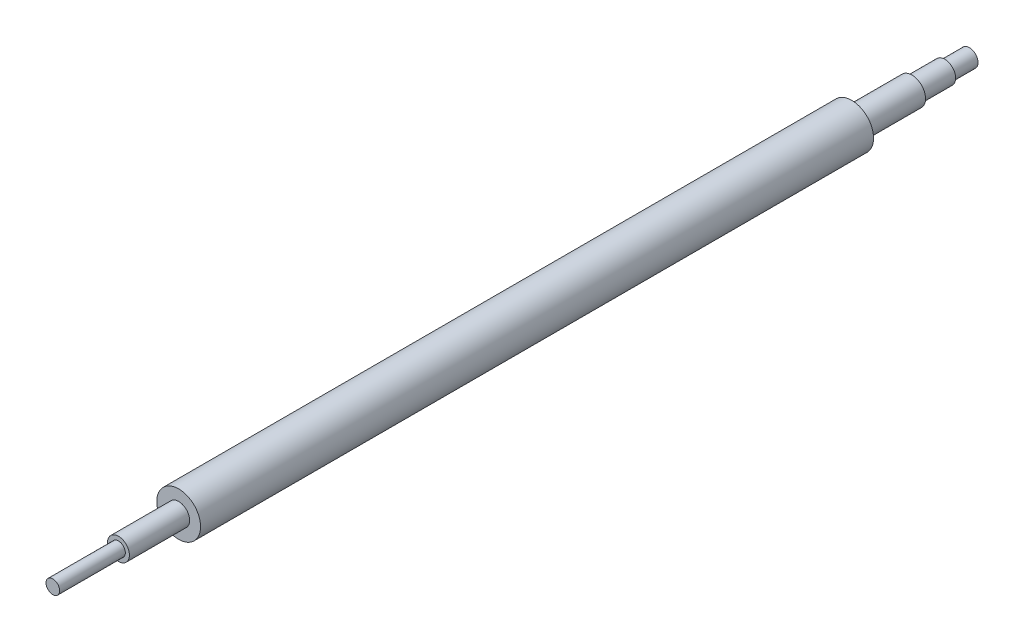
ISO-10303-21;
HEADER;
FILE_DESCRIPTION(('STEP AP214'),'2;1');
FILE_NAME('part.step','',(''),(''),'','','');
FILE_SCHEMA(('AUTOMOTIVE_DESIGN { 1 0 10303 214 1 1 1 1 }'));
ENDSEC;
DATA;
#1=APPLICATION_CONTEXT('core data for automotive mechanical design processes');
#2=APPLICATION_PROTOCOL_DEFINITION('international standard','automotive_design',2000,#1);
#3=PRODUCT_CONTEXT('',#1,'mechanical');
#4=PRODUCT('Part','Part','',(#3));
#5=PRODUCT_RELATED_PRODUCT_CATEGORY('part','',(#4));
#6=PRODUCT_DEFINITION_FORMATION('','',#4);
#7=PRODUCT_DEFINITION_CONTEXT('part definition',#1,'design');
#8=PRODUCT_DEFINITION('design','',#6,#7);
#9=PRODUCT_DEFINITION_SHAPE('','',#8);
#10=(LENGTH_UNIT() NAMED_UNIT(*) SI_UNIT(.MILLI.,.METRE.));
#11=(NAMED_UNIT(*) PLANE_ANGLE_UNIT() SI_UNIT($,.RADIAN.));
#12=(NAMED_UNIT(*) SI_UNIT($,.STERADIAN.) SOLID_ANGLE_UNIT());
#13=UNCERTAINTY_MEASURE_WITH_UNIT(LENGTH_MEASURE(1.E-05),#10,'distance_accuracy_value','');
#14=(GEOMETRIC_REPRESENTATION_CONTEXT(3) GLOBAL_UNCERTAINTY_ASSIGNED_CONTEXT((#13)) GLOBAL_UNIT_ASSIGNED_CONTEXT((#10,
#11,#12)) REPRESENTATION_CONTEXT('',''));
#15=CARTESIAN_POINT('',(0.,0.,0.));
#16=DIRECTION('',(0.,0.,1.));
#17=DIRECTION('',(1.,0.,0.));
#18=AXIS2_PLACEMENT_3D('',#15,#16,#17);
#19=CARTESIAN_POINT('',(0.,0.,292.));
#20=DIRECTION('',(0.,0.,-1.));
#21=DIRECTION('',(-1.,0.,0.));
#22=AXIS2_PLACEMENT_3D('',#19,#20,#21);
#23=CYLINDRICAL_SURFACE('',#22,2.5);
#24=CARTESIAN_POINT('',(0.,0.,292.));
#25=DIRECTION('',(0.,0.,1.));
#26=DIRECTION('',(1.,0.,0.));
#27=AXIS2_PLACEMENT_3D('',#24,#25,#26);
#28=CIRCLE('',#27,2.5);
#29=CARTESIAN_POINT('',(2.5,0.,292.));
#30=VERTEX_POINT('',#29);
#31=EDGE_CURVE('E11',#30,#30,#28,.T.);
#32=ORIENTED_EDGE('',*,*,#31,.F.);
#33=EDGE_LOOP('',(#32));
#34=FACE_BOUND('',#33,.T.);
#35=CARTESIAN_POINT('',(0.,0.,268.));
#36=DIRECTION('',(0.,0.,1.));
#37=DIRECTION('',(1.,0.,0.));
#38=AXIS2_PLACEMENT_3D('',#35,#36,#37);
#39=CIRCLE('',#38,2.5);
#40=CARTESIAN_POINT('',(2.5,0.,268.));
#41=VERTEX_POINT('',#40);
#42=EDGE_CURVE('E44',#41,#41,#39,.T.);
#43=ORIENTED_EDGE('',*,*,#42,.T.);
#44=EDGE_LOOP('',(#43));
#45=FACE_BOUND('',#44,.T.);
#46=ADVANCED_FACE('F41',(#34,#45),#23,.T.);
#47=CARTESIAN_POINT('',(0.,0.,292.));
#48=DIRECTION('',(0.,0.,1.));
#49=DIRECTION('',(1.,0.,0.));
#50=AXIS2_PLACEMENT_3D('',#47,#48,#49);
#51=PLANE('',#50);
#52=ORIENTED_EDGE('',*,*,#31,.T.);
#53=EDGE_LOOP('',(#52));
#54=FACE_BOUND('',#53,.T.);
#55=ADVANCED_FACE('F56',(#54),#51,.T.);
#56=CARTESIAN_POINT('',(0.,0.,268.));
#57=DIRECTION('',(0.,0.,1.));
#58=DIRECTION('',(1.,0.,0.));
#59=AXIS2_PLACEMENT_3D('',#56,#57,#58);
#60=PLANE('',#59);
#61=ORIENTED_EDGE('',*,*,#42,.F.);
#62=EDGE_LOOP('',(#61));
#63=FACE_BOUND('',#62,.T.);
#64=ADVANCED_FACE('F54',(#63),#60,.F.);
#65=CLOSED_SHELL('',(#46,#55,#64));
#66=MANIFOLD_SOLID_BREP('B2',#65);
#67=CARTESIAN_POINT('',(0.,0.,-34.));
#68=DIRECTION('',(0.,0.,-1.));
#69=DIRECTION('',(-1.,0.,0.));
#70=AXIS2_PLACEMENT_3D('',#67,#68,#69);
#71=PLANE('',#70);
#72=CARTESIAN_POINT('',(0.,0.,-34.));
#73=DIRECTION('',(0.,0.,-1.));
#74=DIRECTION('',(-1.,0.,0.));
#75=AXIS2_PLACEMENT_3D('',#72,#73,#74);
#76=CIRCLE('',#75,4.);
#77=CARTESIAN_POINT('',(-4.,0.,-34.));
#78=VERTEX_POINT('',#77);
#79=EDGE_CURVE('E100',#78,#78,#76,.T.);
#80=ORIENTED_EDGE('',*,*,#79,.T.);
#81=EDGE_LOOP('',(#80));
#82=FACE_BOUND('',#81,.T.);
#83=CARTESIAN_POINT('',(0.,0.,-34.));
#84=DIRECTION('',(0.,0.,-1.));
#85=DIRECTION('',(-1.,0.,0.));
#86=AXIS2_PLACEMENT_3D('',#83,#84,#85);
#87=CIRCLE('',#86,3.175);
#88=CARTESIAN_POINT('',(-3.175,0.,-34.));
#89=VERTEX_POINT('',#88);
#90=EDGE_CURVE('E108',#89,#89,#87,.T.);
#91=ORIENTED_EDGE('',*,*,#90,.F.);
#92=EDGE_LOOP('',(#91));
#93=FACE_BOUND('',#92,.T.);
#94=ADVANCED_FACE('F89',(#82,#93),#71,.T.);
#95=CARTESIAN_POINT('',(0.,0.,-22.));
#96=DIRECTION('',(0.,0.,-1.));
#97=DIRECTION('',(-1.,0.,0.));
#98=AXIS2_PLACEMENT_3D('',#95,#96,#97);
#99=PLANE('',#98);
#100=CARTESIAN_POINT('',(0.,0.,-22.));
#101=DIRECTION('',(0.,0.,-1.));
#102=DIRECTION('',(-1.,0.,0.));
#103=AXIS2_PLACEMENT_3D('',#100,#101,#102);
#104=CIRCLE('',#103,5.);
#105=CARTESIAN_POINT('',(-5.,0.,-22.));
#106=VERTEX_POINT('',#105);
#107=EDGE_CURVE('E40',#106,#106,#104,.T.);
#108=ORIENTED_EDGE('',*,*,#107,.T.);
#109=EDGE_LOOP('',(#108));
#110=FACE_BOUND('',#109,.T.);
#111=CARTESIAN_POINT('',(0.,0.,-22.));
#112=DIRECTION('',(0.,0.,-1.));
#113=DIRECTION('',(-1.,0.,0.));
#114=AXIS2_PLACEMENT_3D('',#111,#112,#113);
#115=CIRCLE('',#114,4.);
#116=CARTESIAN_POINT('',(-4.,0.,-22.));
#117=VERTEX_POINT('',#116);
#118=EDGE_CURVE('E102',#117,#117,#115,.T.);
#119=ORIENTED_EDGE('',*,*,#118,.F.);
#120=EDGE_LOOP('',(#119));
#121=FACE_BOUND('',#120,.T.);
#122=ADVANCED_FACE('F124',(#110,#121),#99,.T.);
#123=CARTESIAN_POINT('',(0.,0.,-22.));
#124=DIRECTION('',(0.,0.,1.));
#125=DIRECTION('',(1.,0.,0.));
#126=AXIS2_PLACEMENT_3D('',#123,#124,#125);
#127=CYLINDRICAL_SURFACE('',#126,5.);
#128=ORIENTED_EDGE('',*,*,#107,.F.);
#129=EDGE_LOOP('',(#128));
#130=FACE_BOUND('',#129,.T.);
#131=CARTESIAN_POINT('',(0.,0.,0.));
#132=DIRECTION('',(0.,0.,-1.));
#133=DIRECTION('',(-1.,0.,0.));
#134=AXIS2_PLACEMENT_3D('',#131,#132,#133);
#135=CIRCLE('',#134,5.);
#136=CARTESIAN_POINT('',(-5.,0.,0.));
#137=VERTEX_POINT('',#136);
#138=EDGE_CURVE('E93',#137,#137,#135,.T.);
#139=ORIENTED_EDGE('',*,*,#138,.T.);
#140=EDGE_LOOP('',(#139));
#141=FACE_BOUND('',#140,.T.);
#142=ADVANCED_FACE('F91',(#130,#141),#127,.T.);
#143=CARTESIAN_POINT('',(0.,0.,0.));
#144=DIRECTION('',(0.,0.,-1.));
#145=DIRECTION('',(-1.,0.,0.));
#146=AXIS2_PLACEMENT_3D('',#143,#144,#145);
#147=PLANE('',#146);
#148=ORIENTED_EDGE('',*,*,#138,.F.);
#149=EDGE_LOOP('',(#148));
#150=FACE_BOUND('',#149,.T.);
#151=ADVANCED_FACE('F134',(#150),#147,.F.);
#152=CARTESIAN_POINT('',(0.,0.,-34.));
#153=DIRECTION('',(0.,0.,1.));
#154=DIRECTION('',(1.,0.,0.));
#155=AXIS2_PLACEMENT_3D('',#152,#153,#154);
#156=CYLINDRICAL_SURFACE('',#155,4.);
#157=ORIENTED_EDGE('',*,*,#79,.F.);
#158=EDGE_LOOP('',(#157));
#159=FACE_BOUND('',#158,.T.);
#160=ORIENTED_EDGE('',*,*,#118,.T.);
#161=EDGE_LOOP('',(#160));
#162=FACE_BOUND('',#161,.T.);
#163=ADVANCED_FACE('F119',(#159,#162),#156,.T.);
#164=CARTESIAN_POINT('',(0.,0.,-43.));
#165=DIRECTION('',(0.,0.,1.));
#166=DIRECTION('',(1.,0.,0.));
#167=AXIS2_PLACEMENT_3D('',#164,#165,#166);
#168=CYLINDRICAL_SURFACE('',#167,3.175);
#169=CARTESIAN_POINT('',(0.,0.,-43.));
#170=DIRECTION('',(0.,0.,-1.));
#171=DIRECTION('',(-1.,0.,0.));
#172=AXIS2_PLACEMENT_3D('',#169,#170,#171);
#173=CIRCLE('',#172,3.175);
#174=CARTESIAN_POINT('',(-3.175,0.,-43.));
#175=VERTEX_POINT('',#174);
#176=EDGE_CURVE('E105',#175,#175,#173,.T.);
#177=ORIENTED_EDGE('',*,*,#176,.F.);
#178=EDGE_LOOP('',(#177));
#179=FACE_BOUND('',#178,.T.);
#180=ORIENTED_EDGE('',*,*,#90,.T.);
#181=EDGE_LOOP('',(#180));
#182=FACE_BOUND('',#181,.T.);
#183=ADVANCED_FACE('F116',(#179,#182),#168,.T.);
#184=CARTESIAN_POINT('',(0.,0.,-43.));
#185=DIRECTION('',(0.,0.,-1.));
#186=DIRECTION('',(-1.,0.,0.));
#187=AXIS2_PLACEMENT_3D('',#184,#185,#186);
#188=PLANE('',#187);
#189=ORIENTED_EDGE('',*,*,#176,.T.);
#190=EDGE_LOOP('',(#189));
#191=FACE_BOUND('',#190,.T.);
#192=ADVANCED_FACE('F114',(#191),#188,.T.);
#193=CLOSED_SHELL('',(#94,#122,#142,#151,#163,#183,#192));
#194=MANIFOLD_SOLID_BREP('B6',#193);
#195=CARTESIAN_POINT('',(0.,0.,268.));
#196=DIRECTION('',(0.,0.,-1.));
#197=DIRECTION('',(-1.,0.,0.));
#198=AXIS2_PLACEMENT_3D('',#195,#196,#197);
#199=CYLINDRICAL_SURFACE('',#198,4.);
#200=CARTESIAN_POINT('',(0.,0.,268.));
#201=DIRECTION('',(0.,0.,1.));
#202=DIRECTION('',(1.,0.,0.));
#203=AXIS2_PLACEMENT_3D('',#200,#201,#202);
#204=CIRCLE('',#203,4.);
#205=CARTESIAN_POINT('',(4.,0.,268.));
#206=VERTEX_POINT('',#205);
#207=EDGE_CURVE('E88',#206,#206,#204,.T.);
#208=ORIENTED_EDGE('',*,*,#207,.F.);
#209=EDGE_LOOP('',(#208));
#210=FACE_BOUND('',#209,.T.);
#211=CARTESIAN_POINT('',(0.,0.,246.));
#212=DIRECTION('',(0.,0.,1.));
#213=DIRECTION('',(1.,0.,0.));
#214=AXIS2_PLACEMENT_3D('',#211,#212,#213);
#215=CIRCLE('',#214,4.);
#216=CARTESIAN_POINT('',(4.,0.,246.));
#217=VERTEX_POINT('',#216);
#218=EDGE_CURVE('E199',#217,#217,#215,.T.);
#219=ORIENTED_EDGE('',*,*,#218,.T.);
#220=EDGE_LOOP('',(#219));
#221=FACE_BOUND('',#220,.T.);
#222=ADVANCED_FACE('F196',(#210,#221),#199,.T.);
#223=CARTESIAN_POINT('',(0.,0.,268.));
#224=DIRECTION('',(0.,0.,1.));
#225=DIRECTION('',(1.,0.,0.));
#226=AXIS2_PLACEMENT_3D('',#223,#224,#225);
#227=PLANE('',#226);
#228=ORIENTED_EDGE('',*,*,#207,.T.);
#229=EDGE_LOOP('',(#228));
#230=FACE_BOUND('',#229,.T.);
#231=ADVANCED_FACE('F211',(#230),#227,.T.);
#232=CARTESIAN_POINT('',(0.,0.,246.));
#233=DIRECTION('',(0.,0.,1.));
#234=DIRECTION('',(1.,0.,0.));
#235=AXIS2_PLACEMENT_3D('',#232,#233,#234);
#236=PLANE('',#235);
#237=ORIENTED_EDGE('',*,*,#218,.F.);
#238=EDGE_LOOP('',(#237));
#239=FACE_BOUND('',#238,.T.);
#240=ADVANCED_FACE('F209',(#239),#236,.F.);
#241=CLOSED_SHELL('',(#222,#231,#240));
#242=MANIFOLD_SOLID_BREP('B35',#241);
#243=CARTESIAN_POINT('',(0.,0.,246.));
#244=DIRECTION('',(0.,0.,-1.));
#245=DIRECTION('',(-1.,0.,0.));
#246=AXIS2_PLACEMENT_3D('',#243,#244,#245);
#247=CYLINDRICAL_SURFACE('',#246,8.);
#248=CARTESIAN_POINT('',(0.,0.,246.));
#249=DIRECTION('',(0.,0.,1.));
#250=DIRECTION('',(1.,0.,0.));
#251=AXIS2_PLACEMENT_3D('',#248,#249,#250);
#252=CIRCLE('',#251,8.);
#253=CARTESIAN_POINT('',(8.,0.,246.));
#254=VERTEX_POINT('',#253);
#255=EDGE_CURVE('E195',#254,#254,#252,.T.);
#256=ORIENTED_EDGE('',*,*,#255,.F.);
#257=EDGE_LOOP('',(#256));
#258=FACE_BOUND('',#257,.T.);
#259=CARTESIAN_POINT('',(0.,0.,0.));
#260=DIRECTION('',(0.,0.,1.));
#261=DIRECTION('',(1.,0.,0.));
#262=AXIS2_PLACEMENT_3D('',#259,#260,#261);
#263=CIRCLE('',#262,8.);
#264=CARTESIAN_POINT('',(8.,0.,0.));
#265=VERTEX_POINT('',#264);
#266=EDGE_CURVE('E241',#265,#265,#263,.T.);
#267=ORIENTED_EDGE('',*,*,#266,.T.);
#268=EDGE_LOOP('',(#267));
#269=FACE_BOUND('',#268,.T.);
#270=ADVANCED_FACE('F238',(#258,#269),#247,.T.);
#271=CARTESIAN_POINT('',(0.,0.,246.));
#272=DIRECTION('',(0.,0.,1.));
#273=DIRECTION('',(1.,0.,0.));
#274=AXIS2_PLACEMENT_3D('',#271,#272,#273);
#275=PLANE('',#274);
#276=ORIENTED_EDGE('',*,*,#255,.T.);
#277=EDGE_LOOP('',(#276));
#278=FACE_BOUND('',#277,.T.);
#279=ADVANCED_FACE('F253',(#278),#275,.T.);
#280=CARTESIAN_POINT('',(0.,0.,0.));
#281=DIRECTION('',(0.,0.,1.));
#282=DIRECTION('',(1.,0.,0.));
#283=AXIS2_PLACEMENT_3D('',#280,#281,#282);
#284=PLANE('',#283);
#285=ORIENTED_EDGE('',*,*,#266,.F.);
#286=EDGE_LOOP('',(#285));
#287=FACE_BOUND('',#286,.T.);
#288=ADVANCED_FACE('F251',(#287),#284,.F.);
#289=CLOSED_SHELL('',(#270,#279,#288));
#290=MANIFOLD_SOLID_BREP('B83',#289);
#291=ADVANCED_BREP_SHAPE_REPRESENTATION('',(#18,#66,#194,#242,#290),#14);
#292=SHAPE_DEFINITION_REPRESENTATION(#9,#291);
ENDSEC;
END-ISO-10303-21;
